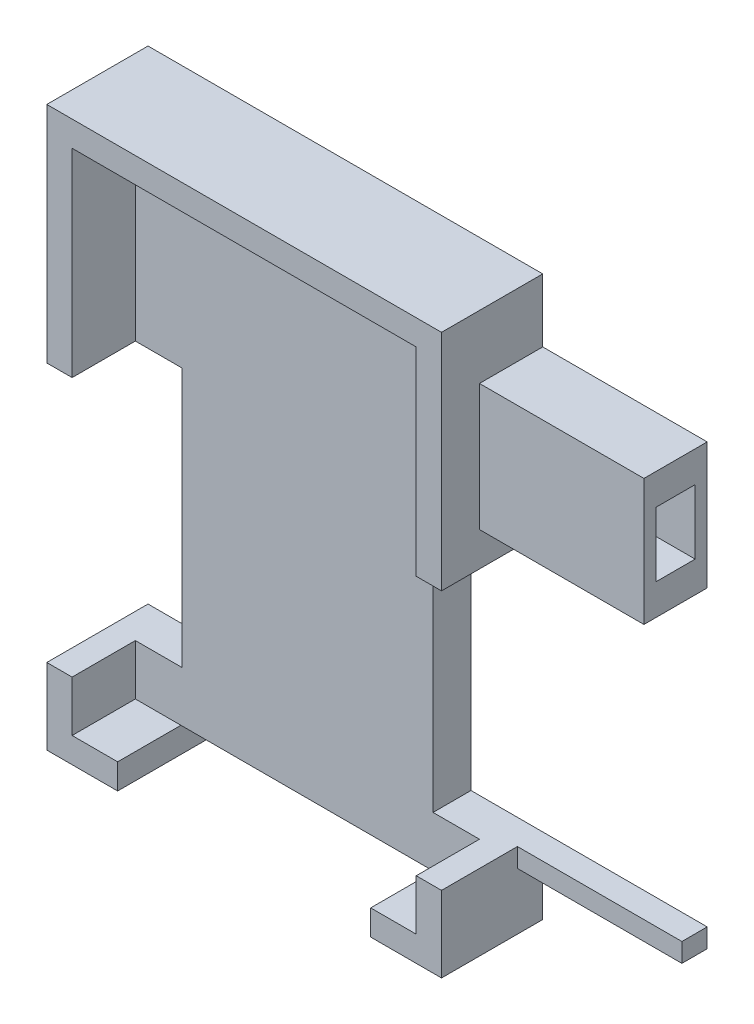
ISO-10303-21;
HEADER;
FILE_DESCRIPTION(('STEP AP214'),'2;1');
FILE_NAME('part.step','',(''),(''),'','','');
FILE_SCHEMA(('AUTOMOTIVE_DESIGN { 1 0 10303 214 1 1 1 1 }'));
ENDSEC;
DATA;
#1=APPLICATION_CONTEXT('core data for automotive mechanical design processes');
#2=APPLICATION_PROTOCOL_DEFINITION('international standard','automotive_design',2000,#1);
#3=PRODUCT_CONTEXT('',#1,'mechanical');
#4=PRODUCT('Part','Part','',(#3));
#5=PRODUCT_RELATED_PRODUCT_CATEGORY('part','',(#4));
#6=PRODUCT_DEFINITION_FORMATION('','',#4);
#7=PRODUCT_DEFINITION_CONTEXT('part definition',#1,'design');
#8=PRODUCT_DEFINITION('design','',#6,#7);
#9=PRODUCT_DEFINITION_SHAPE('','',#8);
#10=(LENGTH_UNIT() NAMED_UNIT(*) SI_UNIT(.MILLI.,.METRE.));
#11=(NAMED_UNIT(*) PLANE_ANGLE_UNIT() SI_UNIT($,.RADIAN.));
#12=(NAMED_UNIT(*) SI_UNIT($,.STERADIAN.) SOLID_ANGLE_UNIT());
#13=UNCERTAINTY_MEASURE_WITH_UNIT(LENGTH_MEASURE(1.E-05),#10,'distance_accuracy_value','');
#14=(GEOMETRIC_REPRESENTATION_CONTEXT(3) GLOBAL_UNCERTAINTY_ASSIGNED_CONTEXT((#13)) GLOBAL_UNIT_ASSIGNED_CONTEXT((#10,
#11,#12)) REPRESENTATION_CONTEXT('',''));
#15=CARTESIAN_POINT('',(0.,0.,0.));
#16=DIRECTION('',(0.,0.,1.));
#17=DIRECTION('',(1.,0.,0.));
#18=AXIS2_PLACEMENT_3D('',#15,#16,#17);
#19=CARTESIAN_POINT('',(0.,-20.1,3.));
#20=DIRECTION('',(0.,1.,0.));
#21=DIRECTION('',(-1.,0.,0.));
#22=AXIS2_PLACEMENT_3D('',#19,#20,#21);
#23=PLANE('',#22);
#24=DIRECTION('',(1.,0.,0.));
#25=VECTOR('',#24,1.);
#26=CARTESIAN_POINT('',(0.,-20.1,3.));
#27=LINE('',#26,#25);
#28=CARTESIAN_POINT('',(-9.99999999999998,-20.1,3.));
#29=VERTEX_POINT('',#28);
#30=CARTESIAN_POINT('',(10.,-20.1,3.));
#31=VERTEX_POINT('',#30);
#32=EDGE_CURVE('E389',#29,#31,#27,.T.);
#33=ORIENTED_EDGE('',*,*,#32,.F.);
#34=DIRECTION('',(0.,0.,-1.));
#35=VECTOR('',#34,1.);
#36=CARTESIAN_POINT('',(-9.99999999999998,-20.1,5.));
#37=LINE('',#36,#35);
#38=CARTESIAN_POINT('',(-9.99999999999998,-20.1,0.));
#39=VERTEX_POINT('',#38);
#40=EDGE_CURVE('E488',#29,#39,#37,.T.);
#41=ORIENTED_EDGE('',*,*,#40,.T.);
#42=DIRECTION('',(1.,0.,0.));
#43=VECTOR('',#42,1.);
#44=CARTESIAN_POINT('',(0.,-20.1,0.));
#45=LINE('',#44,#43);
#46=CARTESIAN_POINT('',(10.,-20.1,0.));
#47=VERTEX_POINT('',#46);
#48=EDGE_CURVE('E422',#39,#47,#45,.T.);
#49=ORIENTED_EDGE('',*,*,#48,.T.);
#50=DIRECTION('',(0.,0.,-1.));
#51=VECTOR('',#50,1.);
#52=CARTESIAN_POINT('',(10.,-20.1,5.));
#53=LINE('',#52,#51);
#54=EDGE_CURVE('E323',#31,#47,#53,.T.);
#55=ORIENTED_EDGE('',*,*,#54,.F.);
#56=EDGE_LOOP('',(#33,#41,#49,#55));
#57=FACE_BOUND('',#56,.T.);
#58=ADVANCED_FACE('F45',(#57),#23,.F.);
#59=CARTESIAN_POINT('',(0.,4.39999999999991,3.));
#60=DIRECTION('',(0.,-1.,0.));
#61=DIRECTION('',(1.,0.,0.));
#62=AXIS2_PLACEMENT_3D('',#59,#60,#61);
#63=PLANE('',#62);
#64=DIRECTION('',(-1.,0.,0.));
#65=VECTOR('',#64,1.);
#66=CARTESIAN_POINT('',(0.,4.39999999999991,3.));
#67=LINE('',#66,#65);
#68=CARTESIAN_POINT('',(-9.92999999999998,4.39999999999995,3.));
#69=VERTEX_POINT('',#68);
#70=CARTESIAN_POINT('',(-13.6,4.39999999999996,3.));
#71=VERTEX_POINT('',#70);
#72=EDGE_CURVE('E375',#69,#71,#67,.T.);
#73=ORIENTED_EDGE('',*,*,#72,.T.);
#74=DIRECTION('',(0.,0.,-1.));
#75=VECTOR('',#74,1.);
#76=CARTESIAN_POINT('',(-13.6,4.39999999999996,5.));
#77=LINE('',#76,#75);
#78=CARTESIAN_POINT('',(-13.6,4.39999999999996,8.));
#79=VERTEX_POINT('',#78);
#80=EDGE_CURVE('E371',#79,#71,#77,.T.);
#81=ORIENTED_EDGE('',*,*,#80,.F.);
#82=DIRECTION('',(-1.,0.,0.));
#83=VECTOR('',#82,1.);
#84=CARTESIAN_POINT('',(0.,4.39999999999991,8.));
#85=LINE('',#84,#83);
#86=CARTESIAN_POINT('',(-15.6,4.39999999999996,8.));
#87=VERTEX_POINT('',#86);
#88=EDGE_CURVE('E582',#79,#87,#85,.T.);
#89=ORIENTED_EDGE('',*,*,#88,.T.);
#90=DIRECTION('',(0.,0.,-1.));
#91=VECTOR('',#90,1.);
#92=CARTESIAN_POINT('',(-15.6,4.39999999999996,5.));
#93=LINE('',#92,#91);
#94=CARTESIAN_POINT('',(-15.6,4.39999999999996,0.));
#95=VERTEX_POINT('',#94);
#96=EDGE_CURVE('E345',#87,#95,#93,.T.);
#97=ORIENTED_EDGE('',*,*,#96,.T.);
#98=DIRECTION('',(-1.,0.,0.));
#99=VECTOR('',#98,1.);
#100=CARTESIAN_POINT('',(0.,4.39999999999991,0.));
#101=LINE('',#100,#99);
#102=CARTESIAN_POINT('',(-9.92999999999998,4.39999999999995,0.));
#103=VERTEX_POINT('',#102);
#104=EDGE_CURVE('E374',#103,#95,#101,.T.);
#105=ORIENTED_EDGE('',*,*,#104,.F.);
#106=DIRECTION('',(0.,0.,-1.));
#107=VECTOR('',#106,1.);
#108=CARTESIAN_POINT('',(-9.92999999999998,4.39999999999995,3.));
#109=LINE('',#108,#107);
#110=EDGE_CURVE('E11',#69,#103,#109,.T.);
#111=ORIENTED_EDGE('',*,*,#110,.F.);
#112=EDGE_LOOP('',(#73,#81,#89,#97,#105,#111));
#113=FACE_BOUND('',#112,.T.);
#114=ADVANCED_FACE('F47',(#113),#63,.T.);
#115=CARTESIAN_POINT('',(-9.92999999999998,0.,3.));
#116=DIRECTION('',(1.,0.,0.));
#117=DIRECTION('',(0.,1.,0.));
#118=AXIS2_PLACEMENT_3D('',#115,#116,#117);
#119=PLANE('',#118);
#120=DIRECTION('',(0.,-1.,0.));
#121=VECTOR('',#120,1.);
#122=CARTESIAN_POINT('',(-9.92999999999998,0.,0.));
#123=LINE('',#122,#121);
#124=CARTESIAN_POINT('',(-9.92999999999998,-16.1,0.));
#125=VERTEX_POINT('',#124);
#126=EDGE_CURVE('E416',#103,#125,#123,.T.);
#127=ORIENTED_EDGE('',*,*,#126,.T.);
#128=DIRECTION('',(0.,0.,-1.));
#129=VECTOR('',#128,1.);
#130=CARTESIAN_POINT('',(-9.92999999999998,-16.1,3.));
#131=LINE('',#130,#129);
#132=CARTESIAN_POINT('',(-9.92999999999998,-16.1,3.));
#133=VERTEX_POINT('',#132);
#134=EDGE_CURVE('E54',#133,#125,#131,.T.);
#135=ORIENTED_EDGE('',*,*,#134,.F.);
#136=DIRECTION('',(0.,-1.,0.));
#137=VECTOR('',#136,1.);
#138=CARTESIAN_POINT('',(-9.92999999999998,0.,3.));
#139=LINE('',#138,#137);
#140=EDGE_CURVE('E379',#69,#133,#139,.T.);
#141=ORIENTED_EDGE('',*,*,#140,.F.);
#142=ORIENTED_EDGE('',*,*,#110,.T.);
#143=EDGE_LOOP('',(#127,#135,#141,#142));
#144=FACE_BOUND('',#143,.T.);
#145=ADVANCED_FACE('F755',(#144),#119,.F.);
#146=CARTESIAN_POINT('',(0.,-16.1,3.));
#147=DIRECTION('',(0.,-1.,0.));
#148=DIRECTION('',(1.,0.,0.));
#149=AXIS2_PLACEMENT_3D('',#146,#147,#148);
#150=PLANE('',#149);
#151=DIRECTION('',(-1.,0.,0.));
#152=VECTOR('',#151,1.);
#153=CARTESIAN_POINT('',(0.,-16.1,0.));
#154=LINE('',#153,#152);
#155=CARTESIAN_POINT('',(-15.6,-16.1,0.));
#156=VERTEX_POINT('',#155);
#157=EDGE_CURVE('E419',#125,#156,#154,.T.);
#158=ORIENTED_EDGE('',*,*,#157,.T.);
#159=DIRECTION('',(0.,0.,-1.));
#160=VECTOR('',#159,1.);
#161=CARTESIAN_POINT('',(-15.6,-16.1,5.));
#162=LINE('',#161,#160);
#163=CARTESIAN_POINT('',(-15.6,-16.1,8.));
#164=VERTEX_POINT('',#163);
#165=EDGE_CURVE('E478',#164,#156,#162,.T.);
#166=ORIENTED_EDGE('',*,*,#165,.F.);
#167=DIRECTION('',(-1.,0.,0.));
#168=VECTOR('',#167,1.);
#169=CARTESIAN_POINT('',(0.,-16.1,8.));
#170=LINE('',#169,#168);
#171=CARTESIAN_POINT('',(-13.6,-16.1,8.));
#172=VERTEX_POINT('',#171);
#173=EDGE_CURVE('E570',#172,#164,#170,.T.);
#174=ORIENTED_EDGE('',*,*,#173,.F.);
#175=DIRECTION('',(0.,0.,-1.));
#176=VECTOR('',#175,1.);
#177=CARTESIAN_POINT('',(-13.6,-16.1,5.));
#178=LINE('',#177,#176);
#179=CARTESIAN_POINT('',(-13.6,-16.1,3.));
#180=VERTEX_POINT('',#179);
#181=EDGE_CURVE('E481',#172,#180,#178,.T.);
#182=ORIENTED_EDGE('',*,*,#181,.T.);
#183=DIRECTION('',(-1.,0.,0.));
#184=VECTOR('',#183,1.);
#185=CARTESIAN_POINT('',(0.,-16.1,3.));
#186=LINE('',#185,#184);
#187=EDGE_CURVE('E383',#133,#180,#186,.T.);
#188=ORIENTED_EDGE('',*,*,#187,.F.);
#189=ORIENTED_EDGE('',*,*,#134,.T.);
#190=EDGE_LOOP('',(#158,#166,#174,#182,#188,#189));
#191=FACE_BOUND('',#190,.T.);
#192=ADVANCED_FACE('F445',(#191),#150,.F.);
#193=CARTESIAN_POINT('',(0.,-16.1,3.));
#194=DIRECTION('',(0.,1.,0.));
#195=DIRECTION('',(0.,0.,1.));
#196=AXIS2_PLACEMENT_3D('',#193,#194,#195);
#197=PLANE('',#196);
#198=DIRECTION('',(0.,0.,-1.));
#199=VECTOR('',#198,1.);
#200=CARTESIAN_POINT('',(15.6,-16.1,5.));
#201=LINE('',#200,#199);
#202=CARTESIAN_POINT('',(15.6,-16.1,8.));
#203=VERTEX_POINT('',#202);
#204=CARTESIAN_POINT('',(15.6,-16.1,2.));
#205=VERTEX_POINT('',#204);
#206=EDGE_CURVE('E297',#203,#205,#201,.T.);
#207=ORIENTED_EDGE('',*,*,#206,.T.);
#208=DIRECTION('',(1.,0.,0.));
#209=VECTOR('',#208,1.);
#210=CARTESIAN_POINT('',(15.6,-16.1,2.));
#211=LINE('',#210,#209);
#212=CARTESIAN_POINT('',(28.6,-16.1,2.));
#213=VERTEX_POINT('',#212);
#214=EDGE_CURVE('E280',#205,#213,#211,.T.);
#215=ORIENTED_EDGE('',*,*,#214,.T.);
#216=DIRECTION('',(0.,0.,-1.));
#217=VECTOR('',#216,1.);
#218=CARTESIAN_POINT('',(28.6,-16.1,2.));
#219=LINE('',#218,#217);
#220=CARTESIAN_POINT('',(28.6,-16.1,0.));
#221=VERTEX_POINT('',#220);
#222=EDGE_CURVE('E718',#213,#221,#219,.T.);
#223=ORIENTED_EDGE('',*,*,#222,.T.);
#224=DIRECTION('',(1.,0.,0.));
#225=VECTOR('',#224,1.);
#226=CARTESIAN_POINT('',(0.,-16.1,0.));
#227=LINE('',#226,#225);
#228=CARTESIAN_POINT('',(9.93000000000002,-16.1,0.));
#229=VERTEX_POINT('',#228);
#230=EDGE_CURVE('E425',#229,#221,#227,.T.);
#231=ORIENTED_EDGE('',*,*,#230,.F.);
#232=DIRECTION('',(0.,0.,-1.));
#233=VECTOR('',#232,1.);
#234=CARTESIAN_POINT('',(9.93000000000002,-16.1,3.));
#235=LINE('',#234,#233);
#236=CARTESIAN_POINT('',(9.93000000000002,-16.1,3.));
#237=VERTEX_POINT('',#236);
#238=EDGE_CURVE('E437',#237,#229,#235,.T.);
#239=ORIENTED_EDGE('',*,*,#238,.F.);
#240=DIRECTION('',(1.,0.,0.));
#241=VECTOR('',#240,1.);
#242=CARTESIAN_POINT('',(0.,-16.1,3.));
#243=LINE('',#242,#241);
#244=CARTESIAN_POINT('',(13.6,-16.1,3.));
#245=VERTEX_POINT('',#244);
#246=EDGE_CURVE('E398',#237,#245,#243,.T.);
#247=ORIENTED_EDGE('',*,*,#246,.T.);
#248=DIRECTION('',(0.,0.,-1.));
#249=VECTOR('',#248,1.);
#250=CARTESIAN_POINT('',(13.6,-16.1,5.));
#251=LINE('',#250,#249);
#252=CARTESIAN_POINT('',(13.6,-16.1,8.));
#253=VERTEX_POINT('',#252);
#254=EDGE_CURVE('E309',#253,#245,#251,.T.);
#255=ORIENTED_EDGE('',*,*,#254,.F.);
#256=DIRECTION('',(1.,0.,0.));
#257=VECTOR('',#256,1.);
#258=CARTESIAN_POINT('',(0.,-16.1,8.));
#259=LINE('',#258,#257);
#260=EDGE_CURVE('E306',#253,#203,#259,.T.);
#261=ORIENTED_EDGE('',*,*,#260,.T.);
#262=EDGE_LOOP('',(#207,#215,#223,#231,#239,#247,#255,#261));
#263=FACE_BOUND('',#262,.T.);
#264=ADVANCED_FACE('F304',(#263),#197,.T.);
#265=CARTESIAN_POINT('',(9.93000000000002,0.,3.));
#266=DIRECTION('',(1.,0.,0.));
#267=DIRECTION('',(0.,0.,-1.));
#268=AXIS2_PLACEMENT_3D('',#265,#266,#267);
#269=PLANE('',#268);
#270=DIRECTION('',(0.,-1.,0.));
#271=VECTOR('',#270,1.);
#272=CARTESIAN_POINT('',(9.93000000000002,0.,0.));
#273=LINE('',#272,#271);
#274=CARTESIAN_POINT('',(9.93000000000002,4.39999999999995,0.));
#275=VERTEX_POINT('',#274);
#276=EDGE_CURVE('E428',#275,#229,#273,.T.);
#277=ORIENTED_EDGE('',*,*,#276,.F.);
#278=DIRECTION('',(0.,0.,-1.));
#279=VECTOR('',#278,1.);
#280=CARTESIAN_POINT('',(9.93000000000002,4.39999999999995,3.));
#281=LINE('',#280,#279);
#282=CARTESIAN_POINT('',(9.93000000000002,4.39999999999995,3.));
#283=VERTEX_POINT('',#282);
#284=EDGE_CURVE('E434',#283,#275,#281,.T.);
#285=ORIENTED_EDGE('',*,*,#284,.F.);
#286=DIRECTION('',(0.,-1.,0.));
#287=VECTOR('',#286,1.);
#288=CARTESIAN_POINT('',(9.93000000000002,0.,3.));
#289=LINE('',#288,#287);
#290=EDGE_CURVE('E403',#283,#237,#289,.T.);
#291=ORIENTED_EDGE('',*,*,#290,.T.);
#292=ORIENTED_EDGE('',*,*,#238,.T.);
#293=EDGE_LOOP('',(#277,#285,#291,#292));
#294=FACE_BOUND('',#293,.T.);
#295=ADVANCED_FACE('F714',(#294),#269,.T.);
#296=CARTESIAN_POINT('',(0.,4.39999999999991,3.));
#297=DIRECTION('',(0.,1.,0.));
#298=DIRECTION('',(-1.,0.,0.));
#299=AXIS2_PLACEMENT_3D('',#296,#297,#298);
#300=PLANE('',#299);
#301=DIRECTION('',(0.,0.,-1.));
#302=VECTOR('',#301,1.);
#303=CARTESIAN_POINT('',(13.6,4.39999999999995,5.));
#304=LINE('',#303,#302);
#305=CARTESIAN_POINT('',(13.6,4.39999999999995,8.));
#306=VERTEX_POINT('',#305);
#307=CARTESIAN_POINT('',(13.6,4.39999999999995,3.));
#308=VERTEX_POINT('',#307);
#309=EDGE_CURVE('E359',#306,#308,#304,.T.);
#310=ORIENTED_EDGE('',*,*,#309,.T.);
#311=DIRECTION('',(1.,0.,0.));
#312=VECTOR('',#311,1.);
#313=CARTESIAN_POINT('',(0.,4.39999999999991,3.));
#314=LINE('',#313,#312);
#315=EDGE_CURVE('E407',#283,#308,#314,.T.);
#316=ORIENTED_EDGE('',*,*,#315,.F.);
#317=ORIENTED_EDGE('',*,*,#284,.T.);
#318=DIRECTION('',(1.,0.,0.));
#319=VECTOR('',#318,1.);
#320=CARTESIAN_POINT('',(0.,4.39999999999991,0.));
#321=LINE('',#320,#319);
#322=CARTESIAN_POINT('',(15.6,4.39999999999996,0.));
#323=VERTEX_POINT('',#322);
#324=EDGE_CURVE('E380',#275,#323,#321,.T.);
#325=ORIENTED_EDGE('',*,*,#324,.T.);
#326=DIRECTION('',(0.,0.,-1.));
#327=VECTOR('',#326,1.);
#328=CARTESIAN_POINT('',(15.6,4.39999999999996,5.));
#329=LINE('',#328,#327);
#330=CARTESIAN_POINT('',(15.6,4.39999999999996,8.));
#331=VERTEX_POINT('',#330);
#332=EDGE_CURVE('E355',#331,#323,#329,.T.);
#333=ORIENTED_EDGE('',*,*,#332,.F.);
#334=DIRECTION('',(1.,0.,0.));
#335=VECTOR('',#334,1.);
#336=CARTESIAN_POINT('',(0.,4.39999999999991,8.));
#337=LINE('',#336,#335);
#338=EDGE_CURVE('E598',#306,#331,#337,.T.);
#339=ORIENTED_EDGE('',*,*,#338,.F.);
#340=EDGE_LOOP('',(#310,#316,#317,#325,#333,#339));
#341=FACE_BOUND('',#340,.T.);
#342=ADVANCED_FACE('F777',(#341),#300,.F.);
#343=CARTESIAN_POINT('',(0.,0.,3.));
#344=DIRECTION('',(0.,0.,1.));
#345=DIRECTION('',(1.,0.,0.));
#346=AXIS2_PLACEMENT_3D('',#343,#344,#345);
#347=PLANE('',#346);
#348=ORIENTED_EDGE('',*,*,#72,.F.);
#349=ORIENTED_EDGE('',*,*,#140,.T.);
#350=ORIENTED_EDGE('',*,*,#187,.T.);
#351=DIRECTION('',(0.,-1.,0.));
#352=VECTOR('',#351,1.);
#353=CARTESIAN_POINT('',(-13.6,0.,3.));
#354=LINE('',#353,#352);
#355=CARTESIAN_POINT('',(-13.6,-20.1,3.));
#356=VERTEX_POINT('',#355);
#357=EDGE_CURVE('E386',#180,#356,#354,.T.);
#358=ORIENTED_EDGE('',*,*,#357,.T.);
#359=EDGE_CURVE('E391',#356,#29,#27,.T.);
#360=ORIENTED_EDGE('',*,*,#359,.T.);
#361=ORIENTED_EDGE('',*,*,#32,.T.);
#362=DIRECTION('',(-1.,0.,0.));
#363=VECTOR('',#362,1.);
#364=CARTESIAN_POINT('',(0.,-20.1,3.));
#365=LINE('',#364,#363);
#366=CARTESIAN_POINT('',(13.6,-20.1,3.));
#367=VERTEX_POINT('',#366);
#368=EDGE_CURVE('E328',#367,#31,#365,.T.);
#369=ORIENTED_EDGE('',*,*,#368,.F.);
#370=DIRECTION('',(0.,-1.,0.));
#371=VECTOR('',#370,1.);
#372=CARTESIAN_POINT('',(13.6,0.,3.));
#373=LINE('',#372,#371);
#374=EDGE_CURVE('E395',#245,#367,#373,.T.);
#375=ORIENTED_EDGE('',*,*,#374,.F.);
#376=ORIENTED_EDGE('',*,*,#246,.F.);
#377=ORIENTED_EDGE('',*,*,#290,.F.);
#378=ORIENTED_EDGE('',*,*,#315,.T.);
#379=CARTESIAN_POINT('',(13.6,20.1,3.));
#380=VERTEX_POINT('',#379);
#381=EDGE_CURVE('E399',#380,#308,#373,.T.);
#382=ORIENTED_EDGE('',*,*,#381,.F.);
#383=DIRECTION('',(1.,0.,0.));
#384=VECTOR('',#383,1.);
#385=CARTESIAN_POINT('',(0.,20.1,3.));
#386=LINE('',#385,#384);
#387=CARTESIAN_POINT('',(-13.6,20.1,3.));
#388=VERTEX_POINT('',#387);
#389=EDGE_CURVE('E411',#388,#380,#386,.T.);
#390=ORIENTED_EDGE('',*,*,#389,.F.);
#391=EDGE_CURVE('E390',#388,#71,#354,.T.);
#392=ORIENTED_EDGE('',*,*,#391,.T.);
#393=EDGE_LOOP('',(#348,#349,#350,#358,#360,#361,#369,#375,#376,#377,#378,#382,#390,#392));
#394=FACE_BOUND('',#393,.T.);
#395=ADVANCED_FACE('F516',(#394),#347,.T.);
#396=CARTESIAN_POINT('',(0.,0.,0.));
#397=DIRECTION('',(0.,0.,1.));
#398=DIRECTION('',(1.,0.,0.));
#399=AXIS2_PLACEMENT_3D('',#396,#397,#398);
#400=PLANE('',#399);
#401=DIRECTION('',(0.,-1.,0.));
#402=VECTOR('',#401,1.);
#403=CARTESIAN_POINT('',(10.,0.,0.));
#404=LINE('',#403,#402);
#405=CARTESIAN_POINT('',(10.,-22.1,0.));
#406=VERTEX_POINT('',#405);
#407=EDGE_CURVE('E493',#47,#406,#404,.T.);
#408=ORIENTED_EDGE('',*,*,#407,.F.);
#409=ORIENTED_EDGE('',*,*,#48,.F.);
#410=DIRECTION('',(0.,-1.,0.));
#411=VECTOR('',#410,1.);
#412=CARTESIAN_POINT('',(-9.99999999999998,0.,0.));
#413=LINE('',#412,#411);
#414=CARTESIAN_POINT('',(-9.99999999999998,-22.1,0.));
#415=VERTEX_POINT('',#414);
#416=EDGE_CURVE('E463',#39,#415,#413,.T.);
#417=ORIENTED_EDGE('',*,*,#416,.T.);
#418=DIRECTION('',(1.,0.,0.));
#419=VECTOR('',#418,1.);
#420=CARTESIAN_POINT('',(0.,-22.1,0.));
#421=LINE('',#420,#419);
#422=CARTESIAN_POINT('',(-15.6,-22.1,0.));
#423=VERTEX_POINT('',#422);
#424=EDGE_CURVE('E459',#423,#415,#421,.T.);
#425=ORIENTED_EDGE('',*,*,#424,.F.);
#426=DIRECTION('',(0.,-1.,0.));
#427=VECTOR('',#426,1.);
#428=CARTESIAN_POINT('',(-15.6,0.,0.));
#429=LINE('',#428,#427);
#430=EDGE_CURVE('E456',#156,#423,#429,.T.);
#431=ORIENTED_EDGE('',*,*,#430,.F.);
#432=ORIENTED_EDGE('',*,*,#157,.F.);
#433=ORIENTED_EDGE('',*,*,#126,.F.);
#434=ORIENTED_EDGE('',*,*,#104,.T.);
#435=DIRECTION('',(0.,-1.,0.));
#436=VECTOR('',#435,1.);
#437=CARTESIAN_POINT('',(-15.6,0.,0.));
#438=LINE('',#437,#436);
#439=CARTESIAN_POINT('',(-15.6,22.1,0.));
#440=VERTEX_POINT('',#439);
#441=EDGE_CURVE('E341',#440,#95,#438,.T.);
#442=ORIENTED_EDGE('',*,*,#441,.F.);
#443=DIRECTION('',(1.,0.,0.));
#444=VECTOR('',#443,1.);
#445=CARTESIAN_POINT('',(0.,22.1,0.));
#446=LINE('',#445,#444);
#447=CARTESIAN_POINT('',(15.6,22.1,0.));
#448=VERTEX_POINT('',#447);
#449=EDGE_CURVE('E337',#440,#448,#446,.T.);
#450=ORIENTED_EDGE('',*,*,#449,.T.);
#451=DIRECTION('',(0.,-1.,0.));
#452=VECTOR('',#451,1.);
#453=CARTESIAN_POINT('',(15.6,0.,0.));
#454=LINE('',#453,#452);
#455=CARTESIAN_POINT('',(15.6,17.1,0.));
#456=VERTEX_POINT('',#455);
#457=EDGE_CURVE('E333',#448,#456,#454,.T.);
#458=ORIENTED_EDGE('',*,*,#457,.T.);
#459=DIRECTION('',(1.,0.,0.));
#460=VECTOR('',#459,1.);
#461=CARTESIAN_POINT('',(0.,17.1,0.));
#462=LINE('',#461,#460);
#463=CARTESIAN_POINT('',(28.6,17.1,0.));
#464=VERTEX_POINT('',#463);
#465=EDGE_CURVE('E664',#456,#464,#462,.T.);
#466=ORIENTED_EDGE('',*,*,#465,.T.);
#467=DIRECTION('',(0.,-1.,0.));
#468=VECTOR('',#467,1.);
#469=CARTESIAN_POINT('',(28.6,0.,0.));
#470=LINE('',#469,#468);
#471=CARTESIAN_POINT('',(28.6,7.09999999999998,0.));
#472=VERTEX_POINT('',#471);
#473=EDGE_CURVE('E676',#464,#472,#470,.T.);
#474=ORIENTED_EDGE('',*,*,#473,.T.);
#475=DIRECTION('',(-1.,0.,0.));
#476=VECTOR('',#475,1.);
#477=CARTESIAN_POINT('',(0.,7.09999999999998,0.));
#478=LINE('',#477,#476);
#479=CARTESIAN_POINT('',(15.6,7.09999999999998,0.));
#480=VERTEX_POINT('',#479);
#481=EDGE_CURVE('E650',#472,#480,#478,.T.);
#482=ORIENTED_EDGE('',*,*,#481,.T.);
#483=EDGE_CURVE('E332',#480,#323,#454,.T.);
#484=ORIENTED_EDGE('',*,*,#483,.T.);
#485=ORIENTED_EDGE('',*,*,#324,.F.);
#486=ORIENTED_EDGE('',*,*,#276,.T.);
#487=ORIENTED_EDGE('',*,*,#230,.T.);
#488=DIRECTION('',(0.,-1.,0.));
#489=VECTOR('',#488,1.);
#490=CARTESIAN_POINT('',(28.6,-16.1,0.));
#491=LINE('',#490,#489);
#492=CARTESIAN_POINT('',(28.6,-17.6,0.));
#493=VERTEX_POINT('',#492);
#494=EDGE_CURVE('E720',#221,#493,#491,.T.);
#495=ORIENTED_EDGE('',*,*,#494,.T.);
#496=DIRECTION('',(-1.,0.,0.));
#497=VECTOR('',#496,1.);
#498=CARTESIAN_POINT('',(15.6,-17.6,0.));
#499=LINE('',#498,#497);
#500=CARTESIAN_POINT('',(15.6,-17.6,0.));
#501=VERTEX_POINT('',#500);
#502=EDGE_CURVE('E61',#493,#501,#499,.T.);
#503=ORIENTED_EDGE('',*,*,#502,.T.);
#504=DIRECTION('',(0.,-1.,0.));
#505=VECTOR('',#504,1.);
#506=CARTESIAN_POINT('',(15.6,0.,0.));
#507=LINE('',#506,#505);
#508=CARTESIAN_POINT('',(15.6,-22.1,0.));
#509=VERTEX_POINT('',#508);
#510=EDGE_CURVE('E500',#501,#509,#507,.T.);
#511=ORIENTED_EDGE('',*,*,#510,.T.);
#512=DIRECTION('',(1.,0.,0.));
#513=VECTOR('',#512,1.);
#514=CARTESIAN_POINT('',(0.,-22.1,0.));
#515=LINE('',#514,#513);
#516=EDGE_CURVE('E496',#406,#509,#515,.T.);
#517=ORIENTED_EDGE('',*,*,#516,.F.);
#518=EDGE_LOOP('',(#408,#409,#417,#425,#431,#432,#433,#434,#442,#450,#458,#466,#474,#482,#484,
#485,#486,#487,#495,#503,#511,#517));
#519=FACE_BOUND('',#518,.T.);
#520=ADVANCED_FACE('F453',(#519),#400,.F.);
#521=CARTESIAN_POINT('',(-13.6,0.,5.));
#522=DIRECTION('',(1.,0.,0.));
#523=DIRECTION('',(0.,0.,-1.));
#524=AXIS2_PLACEMENT_3D('',#521,#522,#523);
#525=PLANE('',#524);
#526=ORIENTED_EDGE('',*,*,#80,.T.);
#527=ORIENTED_EDGE('',*,*,#391,.F.);
#528=DIRECTION('',(0.,0.,-1.));
#529=VECTOR('',#528,1.);
#530=CARTESIAN_POINT('',(-13.6,20.1,5.));
#531=LINE('',#530,#529);
#532=CARTESIAN_POINT('',(-13.6,20.1,8.));
#533=VERTEX_POINT('',#532);
#534=EDGE_CURVE('E367',#533,#388,#531,.T.);
#535=ORIENTED_EDGE('',*,*,#534,.F.);
#536=DIRECTION('',(0.,-1.,0.));
#537=VECTOR('',#536,1.);
#538=CARTESIAN_POINT('',(-13.6,0.,8.));
#539=LINE('',#538,#537);
#540=EDGE_CURVE('E586',#533,#79,#539,.T.);
#541=ORIENTED_EDGE('',*,*,#540,.T.);
#542=EDGE_LOOP('',(#526,#527,#535,#541));
#543=FACE_BOUND('',#542,.T.);
#544=ADVANCED_FACE('F816',(#543),#525,.T.);
#545=CARTESIAN_POINT('',(0.,20.1,5.));
#546=DIRECTION('',(0.,1.,0.));
#547=DIRECTION('',(-1.,0.,0.));
#548=AXIS2_PLACEMENT_3D('',#545,#546,#547);
#549=PLANE('',#548);
#550=ORIENTED_EDGE('',*,*,#389,.T.);
#551=DIRECTION('',(0.,0.,-1.));
#552=VECTOR('',#551,1.);
#553=CARTESIAN_POINT('',(13.6,20.1,5.));
#554=LINE('',#553,#552);
#555=CARTESIAN_POINT('',(13.6,20.1,8.));
#556=VERTEX_POINT('',#555);
#557=EDGE_CURVE('E363',#556,#380,#554,.T.);
#558=ORIENTED_EDGE('',*,*,#557,.F.);
#559=DIRECTION('',(1.,0.,0.));
#560=VECTOR('',#559,1.);
#561=CARTESIAN_POINT('',(0.,20.1,8.));
#562=LINE('',#561,#560);
#563=EDGE_CURVE('E590',#533,#556,#562,.T.);
#564=ORIENTED_EDGE('',*,*,#563,.F.);
#565=ORIENTED_EDGE('',*,*,#534,.T.);
#566=EDGE_LOOP('',(#550,#558,#564,#565));
#567=FACE_BOUND('',#566,.T.);
#568=ADVANCED_FACE('F813',(#567),#549,.F.);
#569=CARTESIAN_POINT('',(13.6,0.,5.));
#570=DIRECTION('',(1.,0.,0.));
#571=DIRECTION('',(0.,1.,0.));
#572=AXIS2_PLACEMENT_3D('',#569,#570,#571);
#573=PLANE('',#572);
#574=ORIENTED_EDGE('',*,*,#381,.T.);
#575=ORIENTED_EDGE('',*,*,#309,.F.);
#576=DIRECTION('',(0.,-1.,0.));
#577=VECTOR('',#576,1.);
#578=CARTESIAN_POINT('',(13.6,0.,8.));
#579=LINE('',#578,#577);
#580=EDGE_CURVE('E594',#556,#306,#579,.T.);
#581=ORIENTED_EDGE('',*,*,#580,.F.);
#582=ORIENTED_EDGE('',*,*,#557,.T.);
#583=EDGE_LOOP('',(#574,#575,#581,#582));
#584=FACE_BOUND('',#583,.T.);
#585=ADVANCED_FACE('F810',(#584),#573,.F.);
#586=CARTESIAN_POINT('',(15.6,0.,5.));
#587=DIRECTION('',(1.,0.,0.));
#588=DIRECTION('',(0.,1.,0.));
#589=AXIS2_PLACEMENT_3D('',#586,#587,#588);
#590=PLANE('',#589);
#591=DIRECTION('',(0.,0.,-1.));
#592=VECTOR('',#591,1.);
#593=CARTESIAN_POINT('',(15.6,17.1,5.));
#594=LINE('',#593,#592);
#595=CARTESIAN_POINT('',(15.6,17.1,5.));
#596=VERTEX_POINT('',#595);
#597=EDGE_CURVE('E686',#596,#456,#594,.T.);
#598=ORIENTED_EDGE('',*,*,#597,.T.);
#599=ORIENTED_EDGE('',*,*,#457,.F.);
#600=DIRECTION('',(0.,0.,-1.));
#601=VECTOR('',#600,1.);
#602=CARTESIAN_POINT('',(15.6,22.1,5.));
#603=LINE('',#602,#601);
#604=CARTESIAN_POINT('',(15.6,22.1,8.));
#605=VERTEX_POINT('',#604);
#606=EDGE_CURVE('E352',#605,#448,#603,.T.);
#607=ORIENTED_EDGE('',*,*,#606,.F.);
#608=DIRECTION('',(0.,-1.,0.));
#609=VECTOR('',#608,1.);
#610=CARTESIAN_POINT('',(15.6,0.,8.));
#611=LINE('',#610,#609);
#612=EDGE_CURVE('E602',#605,#331,#611,.T.);
#613=ORIENTED_EDGE('',*,*,#612,.T.);
#614=ORIENTED_EDGE('',*,*,#332,.T.);
#615=ORIENTED_EDGE('',*,*,#483,.F.);
#616=DIRECTION('',(0.,0.,-1.));
#617=VECTOR('',#616,1.);
#618=CARTESIAN_POINT('',(15.6,7.09999999999998,5.));
#619=LINE('',#618,#617);
#620=CARTESIAN_POINT('',(15.6,7.09999999999998,5.));
#621=VERTEX_POINT('',#620);
#622=EDGE_CURVE('E672',#621,#480,#619,.T.);
#623=ORIENTED_EDGE('',*,*,#622,.F.);
#624=DIRECTION('',(0.,1.,0.));
#625=VECTOR('',#624,1.);
#626=CARTESIAN_POINT('',(15.6,0.,5.));
#627=LINE('',#626,#625);
#628=EDGE_CURVE('E614',#621,#596,#627,.T.);
#629=ORIENTED_EDGE('',*,*,#628,.T.);
#630=EDGE_LOOP('',(#598,#599,#607,#613,#614,#615,#623,#629));
#631=FACE_BOUND('',#630,.T.);
#632=ADVANCED_FACE('F709',(#631),#590,.T.);
#633=CARTESIAN_POINT('',(0.,22.1,5.));
#634=DIRECTION('',(0.,1.,0.));
#635=DIRECTION('',(-1.,0.,0.));
#636=AXIS2_PLACEMENT_3D('',#633,#634,#635);
#637=PLANE('',#636);
#638=ORIENTED_EDGE('',*,*,#449,.F.);
#639=DIRECTION('',(0.,0.,-1.));
#640=VECTOR('',#639,1.);
#641=CARTESIAN_POINT('',(-15.6,22.1,5.));
#642=LINE('',#641,#640);
#643=CARTESIAN_POINT('',(-15.6,22.1,8.));
#644=VERTEX_POINT('',#643);
#645=EDGE_CURVE('E349',#644,#440,#642,.T.);
#646=ORIENTED_EDGE('',*,*,#645,.F.);
#647=DIRECTION('',(1.,0.,0.));
#648=VECTOR('',#647,1.);
#649=CARTESIAN_POINT('',(0.,22.1,8.));
#650=LINE('',#649,#648);
#651=EDGE_CURVE('E606',#644,#605,#650,.T.);
#652=ORIENTED_EDGE('',*,*,#651,.T.);
#653=ORIENTED_EDGE('',*,*,#606,.T.);
#654=EDGE_LOOP('',(#638,#646,#652,#653));
#655=FACE_BOUND('',#654,.T.);
#656=ADVANCED_FACE('F768',(#655),#637,.T.);
#657=CARTESIAN_POINT('',(-15.6,0.,5.));
#658=DIRECTION('',(1.,0.,0.));
#659=DIRECTION('',(0.,1.,0.));
#660=AXIS2_PLACEMENT_3D('',#657,#658,#659);
#661=PLANE('',#660);
#662=ORIENTED_EDGE('',*,*,#441,.T.);
#663=ORIENTED_EDGE('',*,*,#96,.F.);
#664=DIRECTION('',(0.,-1.,0.));
#665=VECTOR('',#664,1.);
#666=CARTESIAN_POINT('',(-15.6,0.,8.));
#667=LINE('',#666,#665);
#668=EDGE_CURVE('E610',#644,#87,#667,.T.);
#669=ORIENTED_EDGE('',*,*,#668,.F.);
#670=ORIENTED_EDGE('',*,*,#645,.T.);
#671=EDGE_LOOP('',(#662,#663,#669,#670));
#672=FACE_BOUND('',#671,.T.);
#673=ADVANCED_FACE('F803',(#672),#661,.F.);
#674=CARTESIAN_POINT('',(0.,0.,5.));
#675=DIRECTION('',(0.,0.,1.));
#676=DIRECTION('',(1.,0.,0.));
#677=AXIS2_PLACEMENT_3D('',#674,#675,#676);
#678=PLANE('',#677);
#679=ORIENTED_EDGE('',*,*,#628,.F.);
#680=DIRECTION('',(-1.,0.,0.));
#681=VECTOR('',#680,1.);
#682=CARTESIAN_POINT('',(0.,7.09999999999998,5.));
#683=LINE('',#682,#681);
#684=CARTESIAN_POINT('',(28.6,7.09999999999998,5.));
#685=VERTEX_POINT('',#684);
#686=EDGE_CURVE('E659',#685,#621,#683,.T.);
#687=ORIENTED_EDGE('',*,*,#686,.F.);
#688=DIRECTION('',(0.,-1.,0.));
#689=VECTOR('',#688,1.);
#690=CARTESIAN_POINT('',(28.6,0.,5.));
#691=LINE('',#690,#689);
#692=CARTESIAN_POINT('',(28.6,17.1,5.));
#693=VERTEX_POINT('',#692);
#694=EDGE_CURVE('E663',#693,#685,#691,.T.);
#695=ORIENTED_EDGE('',*,*,#694,.F.);
#696=DIRECTION('',(1.,0.,0.));
#697=VECTOR('',#696,1.);
#698=CARTESIAN_POINT('',(0.,17.1,5.));
#699=LINE('',#698,#697);
#700=EDGE_CURVE('E668',#596,#693,#699,.T.);
#701=ORIENTED_EDGE('',*,*,#700,.F.);
#702=EDGE_LOOP('',(#679,#687,#695,#701));
#703=FACE_BOUND('',#702,.T.);
#704=ADVANCED_FACE('F707',(#703),#678,.T.);
#705=CARTESIAN_POINT('',(0.,-20.1,5.));
#706=DIRECTION('',(0.,1.,0.));
#707=DIRECTION('',(-1.,0.,0.));
#708=AXIS2_PLACEMENT_3D('',#705,#706,#707);
#709=PLANE('',#708);
#710=DIRECTION('',(0.,0.,-1.));
#711=VECTOR('',#710,1.);
#712=CARTESIAN_POINT('',(13.6,-20.1,5.));
#713=LINE('',#712,#711);
#714=CARTESIAN_POINT('',(13.6,-20.1,8.));
#715=VERTEX_POINT('',#714);
#716=EDGE_CURVE('E316',#715,#367,#713,.T.);
#717=ORIENTED_EDGE('',*,*,#716,.T.);
#718=ORIENTED_EDGE('',*,*,#368,.T.);
#719=CARTESIAN_POINT('',(10.,-20.1,8.));
#720=VERTEX_POINT('',#719);
#721=EDGE_CURVE('E324',#720,#31,#53,.T.);
#722=ORIENTED_EDGE('',*,*,#721,.F.);
#723=DIRECTION('',(1.,0.,0.));
#724=VECTOR('',#723,1.);
#725=CARTESIAN_POINT('',(0.,-20.1,8.));
#726=LINE('',#725,#724);
#727=EDGE_CURVE('E509',#720,#715,#726,.T.);
#728=ORIENTED_EDGE('',*,*,#727,.T.);
#729=EDGE_LOOP('',(#717,#718,#722,#728));
#730=FACE_BOUND('',#729,.T.);
#731=ADVANCED_FACE('F507',(#730),#709,.T.);
#732=CARTESIAN_POINT('',(10.,0.,5.));
#733=DIRECTION('',(1.,0.,0.));
#734=DIRECTION('',(0.,0.,-1.));
#735=AXIS2_PLACEMENT_3D('',#732,#733,#734);
#736=PLANE('',#735);
#737=ORIENTED_EDGE('',*,*,#407,.T.);
#738=DIRECTION('',(0.,0.,-1.));
#739=VECTOR('',#738,1.);
#740=CARTESIAN_POINT('',(10.,-22.1,5.));
#741=LINE('',#740,#739);
#742=CARTESIAN_POINT('',(10.,-22.1,8.));
#743=VERTEX_POINT('',#742);
#744=EDGE_CURVE('E314',#743,#406,#741,.T.);
#745=ORIENTED_EDGE('',*,*,#744,.F.);
#746=DIRECTION('',(0.,-1.,0.));
#747=VECTOR('',#746,1.);
#748=CARTESIAN_POINT('',(10.,0.,8.));
#749=LINE('',#748,#747);
#750=EDGE_CURVE('E539',#720,#743,#749,.T.);
#751=ORIENTED_EDGE('',*,*,#750,.F.);
#752=ORIENTED_EDGE('',*,*,#721,.T.);
#753=ORIENTED_EDGE('',*,*,#54,.T.);
#754=EDGE_LOOP('',(#737,#745,#751,#752,#753));
#755=FACE_BOUND('',#754,.T.);
#756=ADVANCED_FACE('F528',(#755),#736,.F.);
#757=CARTESIAN_POINT('',(0.,-22.1,5.));
#758=DIRECTION('',(0.,1.,0.));
#759=DIRECTION('',(-1.,0.,0.));
#760=AXIS2_PLACEMENT_3D('',#757,#758,#759);
#761=PLANE('',#760);
#762=ORIENTED_EDGE('',*,*,#516,.T.);
#763=DIRECTION('',(0.,0.,-1.));
#764=VECTOR('',#763,1.);
#765=CARTESIAN_POINT('',(15.6,-22.1,5.));
#766=LINE('',#765,#764);
#767=CARTESIAN_POINT('',(15.6,-22.1,8.));
#768=VERTEX_POINT('',#767);
#769=EDGE_CURVE('E308',#768,#509,#766,.T.);
#770=ORIENTED_EDGE('',*,*,#769,.F.);
#771=DIRECTION('',(1.,0.,0.));
#772=VECTOR('',#771,1.);
#773=CARTESIAN_POINT('',(0.,-22.1,8.));
#774=LINE('',#773,#772);
#775=EDGE_CURVE('E537',#743,#768,#774,.T.);
#776=ORIENTED_EDGE('',*,*,#775,.F.);
#777=ORIENTED_EDGE('',*,*,#744,.T.);
#778=EDGE_LOOP('',(#762,#770,#776,#777));
#779=FACE_BOUND('',#778,.T.);
#780=ADVANCED_FACE('F534',(#779),#761,.F.);
#781=CARTESIAN_POINT('',(15.6,0.,5.));
#782=DIRECTION('',(1.,0.,0.));
#783=DIRECTION('',(0.,1.,0.));
#784=AXIS2_PLACEMENT_3D('',#781,#782,#783);
#785=PLANE('',#784);
#786=DIRECTION('',(0.,0.,-1.));
#787=VECTOR('',#786,1.);
#788=CARTESIAN_POINT('',(15.6,-17.6,2.));
#789=LINE('',#788,#787);
#790=CARTESIAN_POINT('',(15.6,-17.6,2.));
#791=VERTEX_POINT('',#790);
#792=EDGE_CURVE('E300',#791,#501,#789,.T.);
#793=ORIENTED_EDGE('',*,*,#792,.F.);
#794=DIRECTION('',(0.,1.,0.));
#795=VECTOR('',#794,1.);
#796=CARTESIAN_POINT('',(15.6,-16.1,2.));
#797=LINE('',#796,#795);
#798=EDGE_CURVE('E284',#791,#205,#797,.T.);
#799=ORIENTED_EDGE('',*,*,#798,.T.);
#800=ORIENTED_EDGE('',*,*,#206,.F.);
#801=DIRECTION('',(0.,-1.,0.));
#802=VECTOR('',#801,1.);
#803=CARTESIAN_POINT('',(15.6,0.,8.));
#804=LINE('',#803,#802);
#805=EDGE_CURVE('E546',#203,#768,#804,.T.);
#806=ORIENTED_EDGE('',*,*,#805,.T.);
#807=ORIENTED_EDGE('',*,*,#769,.T.);
#808=ORIENTED_EDGE('',*,*,#510,.F.);
#809=EDGE_LOOP('',(#793,#799,#800,#806,#807,#808));
#810=FACE_BOUND('',#809,.T.);
#811=ADVANCED_FACE('F295',(#810),#785,.T.);
#812=CARTESIAN_POINT('',(13.6,0.,5.));
#813=DIRECTION('',(1.,0.,0.));
#814=DIRECTION('',(0.,1.,0.));
#815=AXIS2_PLACEMENT_3D('',#812,#813,#814);
#816=PLANE('',#815);
#817=ORIENTED_EDGE('',*,*,#374,.T.);
#818=ORIENTED_EDGE('',*,*,#716,.F.);
#819=DIRECTION('',(0.,-1.,0.));
#820=VECTOR('',#819,1.);
#821=CARTESIAN_POINT('',(13.6,0.,8.));
#822=LINE('',#821,#820);
#823=EDGE_CURVE('E555',#253,#715,#822,.T.);
#824=ORIENTED_EDGE('',*,*,#823,.F.);
#825=ORIENTED_EDGE('',*,*,#254,.T.);
#826=EDGE_LOOP('',(#817,#818,#824,#825));
#827=FACE_BOUND('',#826,.T.);
#828=ADVANCED_FACE('F781',(#827),#816,.F.);
#829=CARTESIAN_POINT('',(-9.99999999999998,0.,5.));
#830=DIRECTION('',(1.,0.,0.));
#831=DIRECTION('',(0.,0.,-1.));
#832=AXIS2_PLACEMENT_3D('',#829,#830,#831);
#833=PLANE('',#832);
#834=ORIENTED_EDGE('',*,*,#416,.F.);
#835=ORIENTED_EDGE('',*,*,#40,.F.);
#836=CARTESIAN_POINT('',(-9.99999999999998,-20.1,8.));
#837=VERTEX_POINT('',#836);
#838=EDGE_CURVE('E489',#837,#29,#37,.T.);
#839=ORIENTED_EDGE('',*,*,#838,.F.);
#840=DIRECTION('',(0.,-1.,0.));
#841=VECTOR('',#840,1.);
#842=CARTESIAN_POINT('',(-9.99999999999998,0.,8.));
#843=LINE('',#842,#841);
#844=CARTESIAN_POINT('',(-9.99999999999998,-22.1,8.));
#845=VERTEX_POINT('',#844);
#846=EDGE_CURVE('E558',#837,#845,#843,.T.);
#847=ORIENTED_EDGE('',*,*,#846,.T.);
#848=DIRECTION('',(0.,0.,-1.));
#849=VECTOR('',#848,1.);
#850=CARTESIAN_POINT('',(-9.99999999999998,-22.1,5.));
#851=LINE('',#850,#849);
#852=EDGE_CURVE('E467',#845,#415,#851,.T.);
#853=ORIENTED_EDGE('',*,*,#852,.T.);
#854=EDGE_LOOP('',(#834,#835,#839,#847,#853));
#855=FACE_BOUND('',#854,.T.);
#856=ADVANCED_FACE('F783',(#855),#833,.T.);
#857=CARTESIAN_POINT('',(0.,-20.1,5.));
#858=DIRECTION('',(0.,1.,0.));
#859=DIRECTION('',(-1.,0.,0.));
#860=AXIS2_PLACEMENT_3D('',#857,#858,#859);
#861=PLANE('',#860);
#862=ORIENTED_EDGE('',*,*,#838,.T.);
#863=ORIENTED_EDGE('',*,*,#359,.F.);
#864=DIRECTION('',(0.,0.,-1.));
#865=VECTOR('',#864,1.);
#866=CARTESIAN_POINT('',(-13.6,-20.1,5.));
#867=LINE('',#866,#865);
#868=CARTESIAN_POINT('',(-13.6,-20.1,8.));
#869=VERTEX_POINT('',#868);
#870=EDGE_CURVE('E484',#869,#356,#867,.T.);
#871=ORIENTED_EDGE('',*,*,#870,.F.);
#872=DIRECTION('',(1.,0.,0.));
#873=VECTOR('',#872,1.);
#874=CARTESIAN_POINT('',(0.,-20.1,8.));
#875=LINE('',#874,#873);
#876=EDGE_CURVE('E562',#869,#837,#875,.T.);
#877=ORIENTED_EDGE('',*,*,#876,.T.);
#878=EDGE_LOOP('',(#862,#863,#871,#877));
#879=FACE_BOUND('',#878,.T.);
#880=ADVANCED_FACE('F789',(#879),#861,.T.);
#881=CARTESIAN_POINT('',(-13.6,0.,5.));
#882=DIRECTION('',(1.,0.,0.));
#883=DIRECTION('',(0.,0.,-1.));
#884=AXIS2_PLACEMENT_3D('',#881,#882,#883);
#885=PLANE('',#884);
#886=ORIENTED_EDGE('',*,*,#870,.T.);
#887=ORIENTED_EDGE('',*,*,#357,.F.);
#888=ORIENTED_EDGE('',*,*,#181,.F.);
#889=DIRECTION('',(0.,-1.,0.));
#890=VECTOR('',#889,1.);
#891=CARTESIAN_POINT('',(-13.6,0.,8.));
#892=LINE('',#891,#890);
#893=EDGE_CURVE('E566',#172,#869,#892,.T.);
#894=ORIENTED_EDGE('',*,*,#893,.T.);
#895=EDGE_LOOP('',(#886,#887,#888,#894));
#896=FACE_BOUND('',#895,.T.);
#897=ADVANCED_FACE('F1027',(#896),#885,.T.);
#898=CARTESIAN_POINT('',(-15.6,0.,5.));
#899=DIRECTION('',(1.,0.,0.));
#900=DIRECTION('',(0.,1.,0.));
#901=AXIS2_PLACEMENT_3D('',#898,#899,#900);
#902=PLANE('',#901);
#903=ORIENTED_EDGE('',*,*,#430,.T.);
#904=DIRECTION('',(0.,0.,-1.));
#905=VECTOR('',#904,1.);
#906=CARTESIAN_POINT('',(-15.6,-22.1,5.));
#907=LINE('',#906,#905);
#908=CARTESIAN_POINT('',(-15.6,-22.1,8.));
#909=VERTEX_POINT('',#908);
#910=EDGE_CURVE('E475',#909,#423,#907,.T.);
#911=ORIENTED_EDGE('',*,*,#910,.F.);
#912=DIRECTION('',(0.,-1.,0.));
#913=VECTOR('',#912,1.);
#914=CARTESIAN_POINT('',(-15.6,0.,8.));
#915=LINE('',#914,#913);
#916=EDGE_CURVE('E574',#164,#909,#915,.T.);
#917=ORIENTED_EDGE('',*,*,#916,.F.);
#918=ORIENTED_EDGE('',*,*,#165,.T.);
#919=EDGE_LOOP('',(#903,#911,#917,#918));
#920=FACE_BOUND('',#919,.T.);
#921=ADVANCED_FACE('F1017',(#920),#902,.F.);
#922=CARTESIAN_POINT('',(0.,-22.1,5.));
#923=DIRECTION('',(0.,1.,0.));
#924=DIRECTION('',(-1.,0.,0.));
#925=AXIS2_PLACEMENT_3D('',#922,#923,#924);
#926=PLANE('',#925);
#927=ORIENTED_EDGE('',*,*,#424,.T.);
#928=ORIENTED_EDGE('',*,*,#852,.F.);
#929=DIRECTION('',(1.,0.,0.));
#930=VECTOR('',#929,1.);
#931=CARTESIAN_POINT('',(0.,-22.1,8.));
#932=LINE('',#931,#930);
#933=EDGE_CURVE('E578',#909,#845,#932,.T.);
#934=ORIENTED_EDGE('',*,*,#933,.F.);
#935=ORIENTED_EDGE('',*,*,#910,.T.);
#936=EDGE_LOOP('',(#927,#928,#934,#935));
#937=FACE_BOUND('',#936,.T.);
#938=ADVANCED_FACE('F1007',(#937),#926,.F.);
#939=CARTESIAN_POINT('',(0.,7.09999999999998,5.));
#940=DIRECTION('',(0.,-1.,0.));
#941=DIRECTION('',(1.,0.,0.));
#942=AXIS2_PLACEMENT_3D('',#939,#940,#941);
#943=PLANE('',#942);
#944=ORIENTED_EDGE('',*,*,#481,.F.);
#945=DIRECTION('',(0.,0.,-1.));
#946=VECTOR('',#945,1.);
#947=CARTESIAN_POINT('',(28.6,7.09999999999998,5.));
#948=LINE('',#947,#946);
#949=EDGE_CURVE('E469',#685,#472,#948,.T.);
#950=ORIENTED_EDGE('',*,*,#949,.F.);
#951=ORIENTED_EDGE('',*,*,#686,.T.);
#952=ORIENTED_EDGE('',*,*,#622,.T.);
#953=EDGE_LOOP('',(#944,#950,#951,#952));
#954=FACE_BOUND('',#953,.T.);
#955=ADVANCED_FACE('F699',(#954),#943,.T.);
#956=CARTESIAN_POINT('',(28.6,0.,5.));
#957=DIRECTION('',(1.,0.,0.));
#958=DIRECTION('',(0.,0.,-1.));
#959=AXIS2_PLACEMENT_3D('',#956,#957,#958);
#960=PLANE('',#959);
#961=DIRECTION('',(0.,0.,-1.));
#962=VECTOR('',#961,1.);
#963=CARTESIAN_POINT('',(28.6,9.54999999999998,4.05000000000001));
#964=LINE('',#963,#962);
#965=CARTESIAN_POINT('',(28.6,9.54999999999998,4.05000000000001));
#966=VERTEX_POINT('',#965);
#967=CARTESIAN_POINT('',(28.6,9.54999999999998,0.950000000000004));
#968=VERTEX_POINT('',#967);
#969=EDGE_CURVE('E69',#966,#968,#964,.T.);
#970=ORIENTED_EDGE('',*,*,#969,.F.);
#971=DIRECTION('',(0.,-1.,0.));
#972=VECTOR('',#971,1.);
#973=CARTESIAN_POINT('',(28.6,14.65,4.05000000000001));
#974=LINE('',#973,#972);
#975=CARTESIAN_POINT('',(28.6,14.65,4.05000000000001));
#976=VERTEX_POINT('',#975);
#977=EDGE_CURVE('E623',#976,#966,#974,.T.);
#978=ORIENTED_EDGE('',*,*,#977,.F.);
#979=DIRECTION('',(0.,0.,-1.));
#980=VECTOR('',#979,1.);
#981=CARTESIAN_POINT('',(28.6,14.65,4.05000000000001));
#982=LINE('',#981,#980);
#983=CARTESIAN_POINT('',(28.6,14.65,0.950000000000004));
#984=VERTEX_POINT('',#983);
#985=EDGE_CURVE('E640',#976,#984,#982,.T.);
#986=ORIENTED_EDGE('',*,*,#985,.T.);
#987=DIRECTION('',(0.,-1.,0.));
#988=VECTOR('',#987,1.);
#989=CARTESIAN_POINT('',(28.6,14.65,0.950000000000004));
#990=LINE('',#989,#988);
#991=EDGE_CURVE('E636',#984,#968,#990,.T.);
#992=ORIENTED_EDGE('',*,*,#991,.T.);
#993=EDGE_LOOP('',(#970,#978,#986,#992));
#994=FACE_BOUND('',#993,.T.);
#995=ORIENTED_EDGE('',*,*,#473,.F.);
#996=DIRECTION('',(0.,0.,-1.));
#997=VECTOR('',#996,1.);
#998=CARTESIAN_POINT('',(28.6,17.1,5.));
#999=LINE('',#998,#997);
#1000=EDGE_CURVE('E689',#693,#464,#999,.T.);
#1001=ORIENTED_EDGE('',*,*,#1000,.F.);
#1002=ORIENTED_EDGE('',*,*,#694,.T.);
#1003=ORIENTED_EDGE('',*,*,#949,.T.);
#1004=EDGE_LOOP('',(#995,#1001,#1002,#1003));
#1005=FACE_BOUND('',#1004,.T.);
#1006=ADVANCED_FACE('F695',(#994,#1005),#960,.T.);
#1007=CARTESIAN_POINT('',(0.,17.1,5.));
#1008=DIRECTION('',(0.,1.,0.));
#1009=DIRECTION('',(0.,0.,1.));
#1010=AXIS2_PLACEMENT_3D('',#1007,#1008,#1009);
#1011=PLANE('',#1010);
#1012=ORIENTED_EDGE('',*,*,#465,.F.);
#1013=ORIENTED_EDGE('',*,*,#597,.F.);
#1014=ORIENTED_EDGE('',*,*,#700,.T.);
#1015=ORIENTED_EDGE('',*,*,#1000,.T.);
#1016=EDGE_LOOP('',(#1012,#1013,#1014,#1015));
#1017=FACE_BOUND('',#1016,.T.);
#1018=ADVANCED_FACE('F704',(#1017),#1011,.T.);
#1019=CARTESIAN_POINT('',(22.6,9.54999999999998,4.05000000000001));
#1020=DIRECTION('',(0.,-1.,0.));
#1021=DIRECTION('',(0.,0.,-1.));
#1022=AXIS2_PLACEMENT_3D('',#1019,#1020,#1021);
#1023=PLANE('',#1022);
#1024=ORIENTED_EDGE('',*,*,#969,.T.);
#1025=DIRECTION('',(1.,0.,0.));
#1026=VECTOR('',#1025,1.);
#1027=CARTESIAN_POINT('',(22.6,9.54999999999998,0.950000000000004));
#1028=LINE('',#1027,#1026);
#1029=CARTESIAN_POINT('',(22.6,9.54999999999998,0.950000000000004));
#1030=VERTEX_POINT('',#1029);
#1031=EDGE_CURVE('E633',#1030,#968,#1028,.T.);
#1032=ORIENTED_EDGE('',*,*,#1031,.F.);
#1033=DIRECTION('',(0.,0.,-1.));
#1034=VECTOR('',#1033,1.);
#1035=CARTESIAN_POINT('',(22.6,9.54999999999998,4.05000000000001));
#1036=LINE('',#1035,#1034);
#1037=CARTESIAN_POINT('',(22.6,9.54999999999998,4.05000000000001));
#1038=VERTEX_POINT('',#1037);
#1039=EDGE_CURVE('E618',#1038,#1030,#1036,.T.);
#1040=ORIENTED_EDGE('',*,*,#1039,.F.);
#1041=DIRECTION('',(1.,0.,0.));
#1042=VECTOR('',#1041,1.);
#1043=CARTESIAN_POINT('',(22.6,9.54999999999998,4.05000000000001));
#1044=LINE('',#1043,#1042);
#1045=EDGE_CURVE('E647',#1038,#966,#1044,.T.);
#1046=ORIENTED_EDGE('',*,*,#1045,.T.);
#1047=EDGE_LOOP('',(#1024,#1032,#1040,#1046));
#1048=FACE_BOUND('',#1047,.T.);
#1049=ADVANCED_FACE('F972',(#1048),#1023,.F.);
#1050=CARTESIAN_POINT('',(22.6,14.65,4.05000000000001));
#1051=DIRECTION('',(0.,0.,1.));
#1052=DIRECTION('',(0.,-1.,0.));
#1053=AXIS2_PLACEMENT_3D('',#1050,#1051,#1052);
#1054=PLANE('',#1053);
#1055=ORIENTED_EDGE('',*,*,#977,.T.);
#1056=ORIENTED_EDGE('',*,*,#1045,.F.);
#1057=DIRECTION('',(0.,-1.,0.));
#1058=VECTOR('',#1057,1.);
#1059=CARTESIAN_POINT('',(22.6,14.65,4.05000000000001));
#1060=LINE('',#1059,#1058);
#1061=CARTESIAN_POINT('',(22.6,14.65,4.05000000000001));
#1062=VERTEX_POINT('',#1061);
#1063=EDGE_CURVE('E629',#1062,#1038,#1060,.T.);
#1064=ORIENTED_EDGE('',*,*,#1063,.F.);
#1065=DIRECTION('',(1.,0.,0.));
#1066=VECTOR('',#1065,1.);
#1067=CARTESIAN_POINT('',(22.6,14.65,4.05000000000001));
#1068=LINE('',#1067,#1066);
#1069=EDGE_CURVE('E651',#1062,#976,#1068,.T.);
#1070=ORIENTED_EDGE('',*,*,#1069,.T.);
#1071=EDGE_LOOP('',(#1055,#1056,#1064,#1070));
#1072=FACE_BOUND('',#1071,.T.);
#1073=ADVANCED_FACE('F962',(#1072),#1054,.F.);
#1074=CARTESIAN_POINT('',(22.6,14.65,4.05000000000001));
#1075=DIRECTION('',(0.,-1.,0.));
#1076=DIRECTION('',(0.,0.,-1.));
#1077=AXIS2_PLACEMENT_3D('',#1074,#1075,#1076);
#1078=PLANE('',#1077);
#1079=ORIENTED_EDGE('',*,*,#985,.F.);
#1080=ORIENTED_EDGE('',*,*,#1069,.F.);
#1081=DIRECTION('',(0.,0.,-1.));
#1082=VECTOR('',#1081,1.);
#1083=CARTESIAN_POINT('',(22.6,14.65,4.05000000000001));
#1084=LINE('',#1083,#1082);
#1085=CARTESIAN_POINT('',(22.6,14.65,0.950000000000004));
#1086=VERTEX_POINT('',#1085);
#1087=EDGE_CURVE('E626',#1062,#1086,#1084,.T.);
#1088=ORIENTED_EDGE('',*,*,#1087,.T.);
#1089=DIRECTION('',(1.,0.,0.));
#1090=VECTOR('',#1089,1.);
#1091=CARTESIAN_POINT('',(22.6,14.65,0.950000000000004));
#1092=LINE('',#1091,#1090);
#1093=EDGE_CURVE('E654',#1086,#984,#1092,.T.);
#1094=ORIENTED_EDGE('',*,*,#1093,.T.);
#1095=EDGE_LOOP('',(#1079,#1080,#1088,#1094));
#1096=FACE_BOUND('',#1095,.T.);
#1097=ADVANCED_FACE('F952',(#1096),#1078,.T.);
#1098=CARTESIAN_POINT('',(22.6,14.65,0.950000000000004));
#1099=DIRECTION('',(0.,0.,1.));
#1100=DIRECTION('',(0.,-1.,0.));
#1101=AXIS2_PLACEMENT_3D('',#1098,#1099,#1100);
#1102=PLANE('',#1101);
#1103=ORIENTED_EDGE('',*,*,#991,.F.);
#1104=ORIENTED_EDGE('',*,*,#1093,.F.);
#1105=DIRECTION('',(0.,-1.,0.));
#1106=VECTOR('',#1105,1.);
#1107=CARTESIAN_POINT('',(22.6,14.65,0.950000000000004));
#1108=LINE('',#1107,#1106);
#1109=EDGE_CURVE('E622',#1086,#1030,#1108,.T.);
#1110=ORIENTED_EDGE('',*,*,#1109,.T.);
#1111=ORIENTED_EDGE('',*,*,#1031,.T.);
#1112=EDGE_LOOP('',(#1103,#1104,#1110,#1111));
#1113=FACE_BOUND('',#1112,.T.);
#1114=ADVANCED_FACE('F941',(#1113),#1102,.T.);
#1115=CARTESIAN_POINT('',(22.6,0.,0.));
#1116=DIRECTION('',(-1.,0.,0.));
#1117=DIRECTION('',(0.,0.,1.));
#1118=AXIS2_PLACEMENT_3D('',#1115,#1116,#1117);
#1119=PLANE('',#1118);
#1120=ORIENTED_EDGE('',*,*,#1039,.T.);
#1121=ORIENTED_EDGE('',*,*,#1109,.F.);
#1122=ORIENTED_EDGE('',*,*,#1087,.F.);
#1123=ORIENTED_EDGE('',*,*,#1063,.T.);
#1124=EDGE_LOOP('',(#1120,#1121,#1122,#1123));
#1125=FACE_BOUND('',#1124,.T.);
#1126=ADVANCED_FACE('F931',(#1125),#1119,.F.);
#1127=CARTESIAN_POINT('',(0.,0.,8.));
#1128=DIRECTION('',(0.,0.,1.));
#1129=DIRECTION('',(1.,0.,0.));
#1130=AXIS2_PLACEMENT_3D('',#1127,#1128,#1129);
#1131=PLANE('',#1130);
#1132=ORIENTED_EDGE('',*,*,#88,.F.);
#1133=ORIENTED_EDGE('',*,*,#540,.F.);
#1134=ORIENTED_EDGE('',*,*,#563,.T.);
#1135=ORIENTED_EDGE('',*,*,#580,.T.);
#1136=ORIENTED_EDGE('',*,*,#338,.T.);
#1137=ORIENTED_EDGE('',*,*,#612,.F.);
#1138=ORIENTED_EDGE('',*,*,#651,.F.);
#1139=ORIENTED_EDGE('',*,*,#668,.T.);
#1140=EDGE_LOOP('',(#1132,#1133,#1134,#1135,#1136,#1137,#1138,#1139));
#1141=FACE_BOUND('',#1140,.T.);
#1142=ADVANCED_FACE('F774',(#1141),#1131,.T.);
#1143=CARTESIAN_POINT('',(0.,0.,8.));
#1144=DIRECTION('',(0.,0.,1.));
#1145=DIRECTION('',(1.,0.,0.));
#1146=AXIS2_PLACEMENT_3D('',#1143,#1144,#1145);
#1147=PLANE('',#1146);
#1148=ORIENTED_EDGE('',*,*,#846,.F.);
#1149=ORIENTED_EDGE('',*,*,#876,.F.);
#1150=ORIENTED_EDGE('',*,*,#893,.F.);
#1151=ORIENTED_EDGE('',*,*,#173,.T.);
#1152=ORIENTED_EDGE('',*,*,#916,.T.);
#1153=ORIENTED_EDGE('',*,*,#933,.T.);
#1154=EDGE_LOOP('',(#1148,#1149,#1150,#1151,#1152,#1153));
#1155=FACE_BOUND('',#1154,.T.);
#1156=ADVANCED_FACE('F915',(#1155),#1147,.T.);
#1157=CARTESIAN_POINT('',(0.,0.,8.));
#1158=DIRECTION('',(0.,0.,1.));
#1159=DIRECTION('',(1.,0.,0.));
#1160=AXIS2_PLACEMENT_3D('',#1157,#1158,#1159);
#1161=PLANE('',#1160);
#1162=ORIENTED_EDGE('',*,*,#727,.F.);
#1163=ORIENTED_EDGE('',*,*,#750,.T.);
#1164=ORIENTED_EDGE('',*,*,#775,.T.);
#1165=ORIENTED_EDGE('',*,*,#805,.F.);
#1166=ORIENTED_EDGE('',*,*,#260,.F.);
#1167=ORIENTED_EDGE('',*,*,#823,.T.);
#1168=EDGE_LOOP('',(#1162,#1163,#1164,#1165,#1166,#1167));
#1169=FACE_BOUND('',#1168,.T.);
#1170=ADVANCED_FACE('F541',(#1169),#1161,.T.);
#1171=CARTESIAN_POINT('',(15.6,-17.6,2.));
#1172=DIRECTION('',(0.,-1.,0.));
#1173=DIRECTION('',(0.,0.,-1.));
#1174=AXIS2_PLACEMENT_3D('',#1171,#1172,#1173);
#1175=PLANE('',#1174);
#1176=ORIENTED_EDGE('',*,*,#502,.F.);
#1177=DIRECTION('',(0.,0.,-1.));
#1178=VECTOR('',#1177,1.);
#1179=CARTESIAN_POINT('',(28.6,-17.6,2.));
#1180=LINE('',#1179,#1178);
#1181=CARTESIAN_POINT('',(28.6,-17.6,2.));
#1182=VERTEX_POINT('',#1181);
#1183=EDGE_CURVE('E726',#1182,#493,#1180,.T.);
#1184=ORIENTED_EDGE('',*,*,#1183,.F.);
#1185=DIRECTION('',(-1.,0.,0.));
#1186=VECTOR('',#1185,1.);
#1187=CARTESIAN_POINT('',(15.6,-17.6,2.));
#1188=LINE('',#1187,#1186);
#1189=EDGE_CURVE('E735',#1182,#791,#1188,.T.);
#1190=ORIENTED_EDGE('',*,*,#1189,.T.);
#1191=ORIENTED_EDGE('',*,*,#792,.T.);
#1192=EDGE_LOOP('',(#1176,#1184,#1190,#1191));
#1193=FACE_BOUND('',#1192,.T.);
#1194=ADVANCED_FACE('F725',(#1193),#1175,.T.);
#1195=CARTESIAN_POINT('',(28.6,-16.1,2.));
#1196=DIRECTION('',(1.,0.,0.));
#1197=DIRECTION('',(0.,1.,0.));
#1198=AXIS2_PLACEMENT_3D('',#1195,#1196,#1197);
#1199=PLANE('',#1198);
#1200=ORIENTED_EDGE('',*,*,#494,.F.);
#1201=ORIENTED_EDGE('',*,*,#222,.F.);
#1202=DIRECTION('',(0.,-1.,0.));
#1203=VECTOR('',#1202,1.);
#1204=CARTESIAN_POINT('',(28.6,-16.1,2.));
#1205=LINE('',#1204,#1203);
#1206=EDGE_CURVE('E287',#213,#1182,#1205,.T.);
#1207=ORIENTED_EDGE('',*,*,#1206,.T.);
#1208=ORIENTED_EDGE('',*,*,#1183,.T.);
#1209=EDGE_LOOP('',(#1200,#1201,#1207,#1208));
#1210=FACE_BOUND('',#1209,.T.);
#1211=ADVANCED_FACE('F739',(#1210),#1199,.T.);
#1212=CARTESIAN_POINT('',(0.,0.,2.));
#1213=DIRECTION('',(0.,0.,1.));
#1214=DIRECTION('',(1.,0.,0.));
#1215=AXIS2_PLACEMENT_3D('',#1212,#1213,#1214);
#1216=PLANE('',#1215);
#1217=ORIENTED_EDGE('',*,*,#798,.F.);
#1218=ORIENTED_EDGE('',*,*,#1189,.F.);
#1219=ORIENTED_EDGE('',*,*,#1206,.F.);
#1220=ORIENTED_EDGE('',*,*,#214,.F.);
#1221=EDGE_LOOP('',(#1217,#1218,#1219,#1220));
#1222=FACE_BOUND('',#1221,.T.);
#1223=ADVANCED_FACE('F282',(#1222),#1216,.T.);
#1224=CLOSED_SHELL('',(#58,#114,#145,#192,#264,#295,#342,#395,#520,#544,#568,#585,#632,#656,
#673,#704,#731,#756,#780,#811,#828,#856,#880,#897,#921,#938,#955,#1006,#1018,#1049,#1073,#1097,
#1114,#1126,#1142,#1156,#1170,#1194,#1211,#1223));
#1225=MANIFOLD_SOLID_BREP('B2',#1224);
#1226=ADVANCED_BREP_SHAPE_REPRESENTATION('',(#18,#1225),#14);
#1227=SHAPE_DEFINITION_REPRESENTATION(#9,#1226);
ENDSEC;
END-ISO-10303-21;
